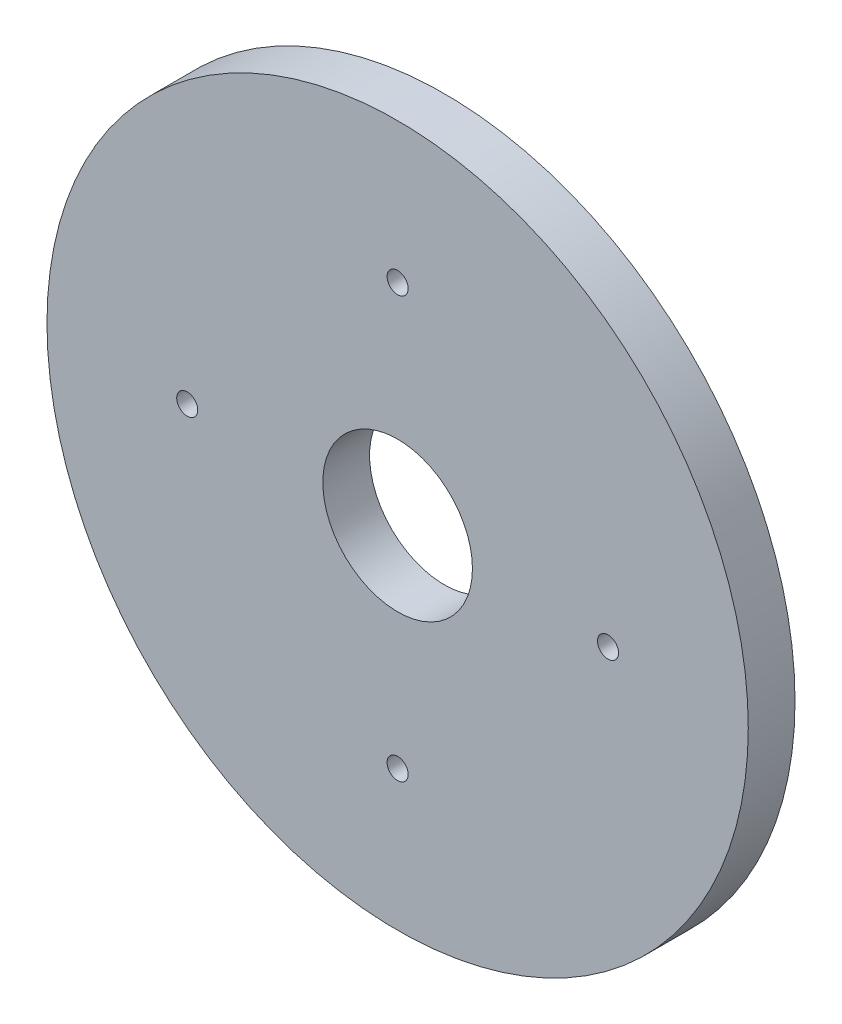
ISO-10303-21;
HEADER;
FILE_DESCRIPTION(('STEP AP214'),'2;1');
FILE_NAME('part.step','',(''),(''),'','','');
FILE_SCHEMA(('AUTOMOTIVE_DESIGN { 1 0 10303 214 1 1 1 1 }'));
ENDSEC;
DATA;
#1=APPLICATION_CONTEXT('core data for automotive mechanical design processes');
#2=APPLICATION_PROTOCOL_DEFINITION('international standard','automotive_design',2000,#1);
#3=PRODUCT_CONTEXT('',#1,'mechanical');
#4=PRODUCT('Part','Part','',(#3));
#5=PRODUCT_RELATED_PRODUCT_CATEGORY('part','',(#4));
#6=PRODUCT_DEFINITION_FORMATION('','',#4);
#7=PRODUCT_DEFINITION_CONTEXT('part definition',#1,'design');
#8=PRODUCT_DEFINITION('design','',#6,#7);
#9=PRODUCT_DEFINITION_SHAPE('','',#8);
#10=(LENGTH_UNIT() NAMED_UNIT(*) SI_UNIT(.MILLI.,.METRE.));
#11=(NAMED_UNIT(*) PLANE_ANGLE_UNIT() SI_UNIT($,.RADIAN.));
#12=(NAMED_UNIT(*) SI_UNIT($,.STERADIAN.) SOLID_ANGLE_UNIT());
#13=UNCERTAINTY_MEASURE_WITH_UNIT(LENGTH_MEASURE(1.E-05),#10,'distance_accuracy_value','');
#14=(GEOMETRIC_REPRESENTATION_CONTEXT(3) GLOBAL_UNCERTAINTY_ASSIGNED_CONTEXT((#13)) GLOBAL_UNIT_ASSIGNED_CONTEXT((#10,
#11,#12)) REPRESENTATION_CONTEXT('',''));
#15=CARTESIAN_POINT('',(0.,0.,0.));
#16=DIRECTION('',(0.,0.,1.));
#17=DIRECTION('',(1.,0.,0.));
#18=AXIS2_PLACEMENT_3D('',#15,#16,#17);
#19=CARTESIAN_POINT('',(300.,300.,123.));
#20=DIRECTION('',(0.,0.,-1.));
#21=DIRECTION('',(-1.,0.,0.));
#22=AXIS2_PLACEMENT_3D('',#19,#20,#21);
#23=CYLINDRICAL_SURFACE('',#22,75.);
#24=CARTESIAN_POINT('',(300.,300.,123.));
#25=DIRECTION('',(0.,0.,1.));
#26=DIRECTION('',(1.,0.,0.));
#27=AXIS2_PLACEMENT_3D('',#24,#25,#26);
#28=CIRCLE('',#27,75.);
#29=CARTESIAN_POINT('',(375.,300.,123.));
#30=VERTEX_POINT('',#29);
#31=EDGE_CURVE('E10',#30,#30,#28,.T.);
#32=ORIENTED_EDGE('',*,*,#31,.F.);
#33=EDGE_LOOP('',(#32));
#34=FACE_BOUND('',#33,.T.);
#35=CARTESIAN_POINT('',(300.,300.,113.));
#36=DIRECTION('',(0.,0.,1.));
#37=DIRECTION('',(1.,0.,0.));
#38=AXIS2_PLACEMENT_3D('',#35,#36,#37);
#39=CIRCLE('',#38,75.);
#40=CARTESIAN_POINT('',(375.,300.,113.));
#41=VERTEX_POINT('',#40);
#42=EDGE_CURVE('E42',#41,#41,#39,.T.);
#43=ORIENTED_EDGE('',*,*,#42,.T.);
#44=EDGE_LOOP('',(#43));
#45=FACE_BOUND('',#44,.T.);
#46=ADVANCED_FACE('F40',(#34,#45),#23,.T.);
#47=CARTESIAN_POINT('',(300.,300.,123.));
#48=DIRECTION('',(0.,0.,1.));
#49=DIRECTION('',(1.,0.,0.));
#50=AXIS2_PLACEMENT_3D('',#47,#48,#49);
#51=PLANE('',#50);
#52=CARTESIAN_POINT('',(300.,255.,123.));
#53=DIRECTION('',(0.,0.,1.));
#54=DIRECTION('',(1.,0.,0.));
#55=AXIS2_PLACEMENT_3D('',#52,#53,#54);
#56=CIRCLE('',#55,2.24999999999996);
#57=CARTESIAN_POINT('',(302.25,255.,123.));
#58=VERTEX_POINT('',#57);
#59=EDGE_CURVE('E79',#58,#58,#56,.T.);
#60=ORIENTED_EDGE('',*,*,#59,.F.);
#61=EDGE_LOOP('',(#60));
#62=FACE_BOUND('',#61,.T.);
#63=CARTESIAN_POINT('',(300.,345.,123.));
#64=DIRECTION('',(0.,0.,1.));
#65=DIRECTION('',(1.,0.,0.));
#66=AXIS2_PLACEMENT_3D('',#63,#64,#65);
#67=CIRCLE('',#66,2.24999999999996);
#68=CARTESIAN_POINT('',(302.25,345.,123.));
#69=VERTEX_POINT('',#68);
#70=EDGE_CURVE('E66',#69,#69,#67,.T.);
#71=ORIENTED_EDGE('',*,*,#70,.F.);
#72=EDGE_LOOP('',(#71));
#73=FACE_BOUND('',#72,.T.);
#74=CARTESIAN_POINT('',(255.,300.,123.));
#75=DIRECTION('',(0.,0.,1.));
#76=DIRECTION('',(1.,0.,0.));
#77=AXIS2_PLACEMENT_3D('',#74,#75,#76);
#78=CIRCLE('',#77,2.24999999999996);
#79=CARTESIAN_POINT('',(257.25,300.,123.));
#80=VERTEX_POINT('',#79);
#81=EDGE_CURVE('E65',#80,#80,#78,.T.);
#82=ORIENTED_EDGE('',*,*,#81,.F.);
#83=EDGE_LOOP('',(#82));
#84=FACE_BOUND('',#83,.T.);
#85=CARTESIAN_POINT('',(345.,300.,123.));
#86=DIRECTION('',(0.,0.,1.));
#87=DIRECTION('',(1.,0.,0.));
#88=AXIS2_PLACEMENT_3D('',#85,#86,#87);
#89=CIRCLE('',#88,2.24999999999996);
#90=CARTESIAN_POINT('',(347.25,300.,123.));
#91=VERTEX_POINT('',#90);
#92=EDGE_CURVE('E58',#91,#91,#89,.T.);
#93=ORIENTED_EDGE('',*,*,#92,.F.);
#94=EDGE_LOOP('',(#93));
#95=FACE_BOUND('',#94,.T.);
#96=CARTESIAN_POINT('',(300.,300.,123.));
#97=DIRECTION('',(0.,0.,1.));
#98=DIRECTION('',(1.,0.,0.));
#99=AXIS2_PLACEMENT_3D('',#96,#97,#98);
#100=CIRCLE('',#99,16.);
#101=CARTESIAN_POINT('',(316.,300.,123.));
#102=VERTEX_POINT('',#101);
#103=EDGE_CURVE('E55',#102,#102,#100,.T.);
#104=ORIENTED_EDGE('',*,*,#103,.F.);
#105=EDGE_LOOP('',(#104));
#106=FACE_BOUND('',#105,.T.);
#107=ORIENTED_EDGE('',*,*,#31,.T.);
#108=EDGE_LOOP('',(#107));
#109=FACE_BOUND('',#108,.T.);
#110=ADVANCED_FACE('F82',(#62,#73,#84,#95,#106,#109),#51,.T.);
#111=CARTESIAN_POINT('',(300.,300.,113.));
#112=DIRECTION('',(0.,0.,1.));
#113=DIRECTION('',(1.,0.,0.));
#114=AXIS2_PLACEMENT_3D('',#111,#112,#113);
#115=PLANE('',#114);
#116=CARTESIAN_POINT('',(300.,255.,113.));
#117=DIRECTION('',(0.,0.,1.));
#118=DIRECTION('',(1.,0.,0.));
#119=AXIS2_PLACEMENT_3D('',#116,#117,#118);
#120=CIRCLE('',#119,2.24999999999996);
#121=CARTESIAN_POINT('',(302.25,255.,113.));
#122=VERTEX_POINT('',#121);
#123=EDGE_CURVE('E37',#122,#122,#120,.T.);
#124=ORIENTED_EDGE('',*,*,#123,.T.);
#125=EDGE_LOOP('',(#124));
#126=FACE_BOUND('',#125,.T.);
#127=CARTESIAN_POINT('',(300.,345.,113.));
#128=DIRECTION('',(0.,0.,1.));
#129=DIRECTION('',(1.,0.,0.));
#130=AXIS2_PLACEMENT_3D('',#127,#128,#129);
#131=CIRCLE('',#130,2.24999999999996);
#132=CARTESIAN_POINT('',(302.25,345.,113.));
#133=VERTEX_POINT('',#132);
#134=EDGE_CURVE('E63',#133,#133,#131,.T.);
#135=ORIENTED_EDGE('',*,*,#134,.T.);
#136=EDGE_LOOP('',(#135));
#137=FACE_BOUND('',#136,.T.);
#138=CARTESIAN_POINT('',(255.,300.,113.));
#139=DIRECTION('',(0.,0.,1.));
#140=DIRECTION('',(1.,0.,0.));
#141=AXIS2_PLACEMENT_3D('',#138,#139,#140);
#142=CIRCLE('',#141,2.24999999999996);
#143=CARTESIAN_POINT('',(257.25,300.,113.));
#144=VERTEX_POINT('',#143);
#145=EDGE_CURVE('E64',#144,#144,#142,.T.);
#146=ORIENTED_EDGE('',*,*,#145,.T.);
#147=EDGE_LOOP('',(#146));
#148=FACE_BOUND('',#147,.T.);
#149=CARTESIAN_POINT('',(345.,300.,113.));
#150=DIRECTION('',(0.,0.,1.));
#151=DIRECTION('',(1.,0.,0.));
#152=AXIS2_PLACEMENT_3D('',#149,#150,#151);
#153=CIRCLE('',#152,2.24999999999996);
#154=CARTESIAN_POINT('',(347.25,300.,113.));
#155=VERTEX_POINT('',#154);
#156=EDGE_CURVE('E60',#155,#155,#153,.T.);
#157=ORIENTED_EDGE('',*,*,#156,.T.);
#158=EDGE_LOOP('',(#157));
#159=FACE_BOUND('',#158,.T.);
#160=CARTESIAN_POINT('',(300.,300.,113.));
#161=DIRECTION('',(0.,0.,1.));
#162=DIRECTION('',(1.,0.,0.));
#163=AXIS2_PLACEMENT_3D('',#160,#161,#162);
#164=CIRCLE('',#163,16.);
#165=CARTESIAN_POINT('',(316.,300.,113.));
#166=VERTEX_POINT('',#165);
#167=EDGE_CURVE('E47',#166,#166,#164,.T.);
#168=ORIENTED_EDGE('',*,*,#167,.T.);
#169=EDGE_LOOP('',(#168));
#170=FACE_BOUND('',#169,.T.);
#171=ORIENTED_EDGE('',*,*,#42,.F.);
#172=EDGE_LOOP('',(#171));
#173=FACE_BOUND('',#172,.T.);
#174=ADVANCED_FACE('F87',(#126,#137,#148,#159,#170,#173),#115,.F.);
#175=CARTESIAN_POINT('',(300.,300.,93.));
#176=DIRECTION('',(0.,0.,1.));
#177=DIRECTION('',(1.,0.,0.));
#178=AXIS2_PLACEMENT_3D('',#175,#176,#177);
#179=CYLINDRICAL_SURFACE('',#178,16.);
#180=ORIENTED_EDGE('',*,*,#103,.T.);
#181=EDGE_LOOP('',(#180));
#182=FACE_BOUND('',#181,.T.);
#183=ORIENTED_EDGE('',*,*,#167,.F.);
#184=EDGE_LOOP('',(#183));
#185=FACE_BOUND('',#184,.T.);
#186=ADVANCED_FACE('F91',(#182,#185),#179,.F.);
#187=CARTESIAN_POINT('',(345.,300.,93.));
#188=DIRECTION('',(0.,0.,1.));
#189=DIRECTION('',(1.,0.,0.));
#190=AXIS2_PLACEMENT_3D('',#187,#188,#189);
#191=CYLINDRICAL_SURFACE('',#190,2.24999999999996);
#192=ORIENTED_EDGE('',*,*,#92,.T.);
#193=EDGE_LOOP('',(#192));
#194=FACE_BOUND('',#193,.T.);
#195=ORIENTED_EDGE('',*,*,#156,.F.);
#196=EDGE_LOOP('',(#195));
#197=FACE_BOUND('',#196,.T.);
#198=ADVANCED_FACE('F81',(#194,#197),#191,.F.);
#199=CARTESIAN_POINT('',(255.,300.,93.));
#200=DIRECTION('',(0.,0.,1.));
#201=DIRECTION('',(1.,0.,0.));
#202=AXIS2_PLACEMENT_3D('',#199,#200,#201);
#203=CYLINDRICAL_SURFACE('',#202,2.24999999999996);
#204=ORIENTED_EDGE('',*,*,#81,.T.);
#205=EDGE_LOOP('',(#204));
#206=FACE_BOUND('',#205,.T.);
#207=ORIENTED_EDGE('',*,*,#145,.F.);
#208=EDGE_LOOP('',(#207));
#209=FACE_BOUND('',#208,.T.);
#210=ADVANCED_FACE('F125',(#206,#209),#203,.F.);
#211=CARTESIAN_POINT('',(300.,345.,93.));
#212=DIRECTION('',(0.,0.,1.));
#213=DIRECTION('',(1.,0.,0.));
#214=AXIS2_PLACEMENT_3D('',#211,#212,#213);
#215=CYLINDRICAL_SURFACE('',#214,2.24999999999996);
#216=ORIENTED_EDGE('',*,*,#70,.T.);
#217=EDGE_LOOP('',(#216));
#218=FACE_BOUND('',#217,.T.);
#219=ORIENTED_EDGE('',*,*,#134,.F.);
#220=EDGE_LOOP('',(#219));
#221=FACE_BOUND('',#220,.T.);
#222=ADVANCED_FACE('F128',(#218,#221),#215,.F.);
#223=CARTESIAN_POINT('',(300.,255.,93.));
#224=DIRECTION('',(0.,0.,1.));
#225=DIRECTION('',(1.,0.,0.));
#226=AXIS2_PLACEMENT_3D('',#223,#224,#225);
#227=CYLINDRICAL_SURFACE('',#226,2.24999999999996);
#228=ORIENTED_EDGE('',*,*,#59,.T.);
#229=EDGE_LOOP('',(#228));
#230=FACE_BOUND('',#229,.T.);
#231=ORIENTED_EDGE('',*,*,#123,.F.);
#232=EDGE_LOOP('',(#231));
#233=FACE_BOUND('',#232,.T.);
#234=ADVANCED_FACE('F138',(#230,#233),#227,.F.);
#235=CLOSED_SHELL('',(#46,#110,#174,#186,#198,#210,#222,#234));
#236=MANIFOLD_SOLID_BREP('B2',#235);
#237=ADVANCED_BREP_SHAPE_REPRESENTATION('',(#18,#236),#14);
#238=SHAPE_DEFINITION_REPRESENTATION(#9,#237);
ENDSEC;
END-ISO-10303-21;
